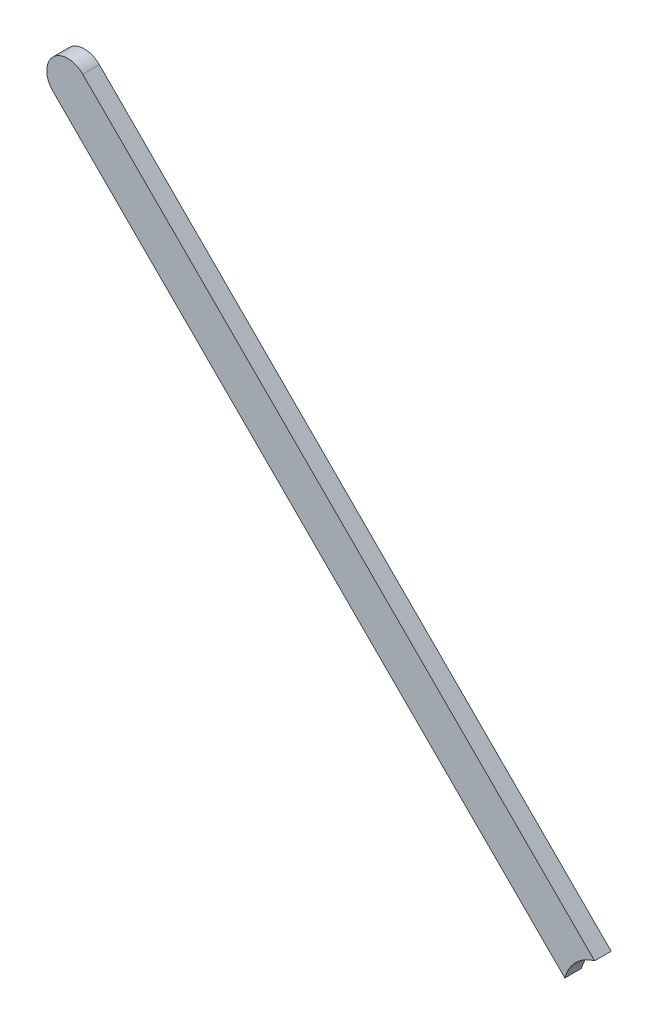
ISO-10303-21;
HEADER;
FILE_DESCRIPTION(('STEP AP214'),'2;1');
FILE_NAME('part.step','',(''),(''),'','','');
FILE_SCHEMA(('AUTOMOTIVE_DESIGN { 1 0 10303 214 1 1 1 1 }'));
ENDSEC;
DATA;
#1=APPLICATION_CONTEXT('core data for automotive mechanical design processes');
#2=APPLICATION_PROTOCOL_DEFINITION('international standard','automotive_design',2000,#1);
#3=PRODUCT_CONTEXT('',#1,'mechanical');
#4=PRODUCT('Part','Part','',(#3));
#5=PRODUCT_RELATED_PRODUCT_CATEGORY('part','',(#4));
#6=PRODUCT_DEFINITION_FORMATION('','',#4);
#7=PRODUCT_DEFINITION_CONTEXT('part definition',#1,'design');
#8=PRODUCT_DEFINITION('design','',#6,#7);
#9=PRODUCT_DEFINITION_SHAPE('','',#8);
#10=(LENGTH_UNIT() NAMED_UNIT(*) SI_UNIT(.MILLI.,.METRE.));
#11=(NAMED_UNIT(*) PLANE_ANGLE_UNIT() SI_UNIT($,.RADIAN.));
#12=(NAMED_UNIT(*) SI_UNIT($,.STERADIAN.) SOLID_ANGLE_UNIT());
#13=UNCERTAINTY_MEASURE_WITH_UNIT(LENGTH_MEASURE(1.E-05),#10,'distance_accuracy_value','');
#14=(GEOMETRIC_REPRESENTATION_CONTEXT(3) GLOBAL_UNCERTAINTY_ASSIGNED_CONTEXT((#13)) GLOBAL_UNIT_ASSIGNED_CONTEXT((#10,
#11,#12)) REPRESENTATION_CONTEXT('',''));
#15=CARTESIAN_POINT('',(0.,0.,0.));
#16=DIRECTION('',(0.,0.,1.));
#17=DIRECTION('',(1.,0.,0.));
#18=AXIS2_PLACEMENT_3D('',#15,#16,#17);
#19=CARTESIAN_POINT('',(141.6661378,61.46517806,0.));
#20=DIRECTION('',(0.707106781186548,0.707106781186548,0.));
#21=DIRECTION('',(0.707106781186548,-0.707106781186548,0.));
#22=AXIS2_PLACEMENT_3D('',#19,#20,#21);
#23=PLANE('',#22);
#24=DIRECTION('',(0.707106781186548,-0.707106781186548,0.));
#25=VECTOR('',#24,1.);
#26=CARTESIAN_POINT('',(141.6661378,61.46517806,0.1999996));
#27=LINE('',#26,#25);
#28=CARTESIAN_POINT('',(141.6661378,61.46517806,0.1999996));
#29=VERTEX_POINT('',#28);
#30=CARTESIAN_POINT('',(147.845309871461,55.2860059885386,0.1999996));
#31=VERTEX_POINT('',#30);
#32=EDGE_CURVE('E11',#29,#31,#27,.T.);
#33=ORIENTED_EDGE('',*,*,#32,.F.);
#34=DIRECTION('',(0.,0.,1.));
#35=VECTOR('',#34,1.);
#36=CARTESIAN_POINT('',(141.6661378,61.46517806,0.));
#37=LINE('',#36,#35);
#38=CARTESIAN_POINT('',(141.6661378,61.46517806,0.));
#39=VERTEX_POINT('',#38);
#40=EDGE_CURVE('E24',#39,#29,#37,.T.);
#41=ORIENTED_EDGE('',*,*,#40,.F.);
#42=DIRECTION('',(0.707106781186548,-0.707106781186548,0.));
#43=VECTOR('',#42,1.);
#44=CARTESIAN_POINT('',(141.6661378,61.46517806,0.));
#45=LINE('',#44,#43);
#46=CARTESIAN_POINT('',(147.845309871461,55.2860059885386,0.));
#47=VERTEX_POINT('',#46);
#48=EDGE_CURVE('E75',#39,#47,#45,.T.);
#49=ORIENTED_EDGE('',*,*,#48,.T.);
#50=DIRECTION('',(0.,0.,1.));
#51=VECTOR('',#50,1.);
#52=CARTESIAN_POINT('',(147.845309871461,55.2860059885386,0.));
#53=LINE('',#52,#51);
#54=EDGE_CURVE('E37',#47,#31,#53,.T.);
#55=ORIENTED_EDGE('',*,*,#54,.T.);
#56=EDGE_LOOP('',(#33,#41,#49,#55));
#57=FACE_BOUND('',#56,.T.);
#58=ADVANCED_FACE('F17',(#57),#23,.F.);
#59=CARTESIAN_POINT('',(148.336,55.1545252,0.));
#60=DIRECTION('',(0.,0.,-1.));
#61=DIRECTION('',(1.,0.,0.));
#62=AXIS2_PLACEMENT_3D('',#59,#60,#61);
#63=CYLINDRICAL_SURFACE('',#62,0.508);
#64=DIRECTION('',(0.,0.,1.));
#65=VECTOR('',#64,1.);
#66=CARTESIAN_POINT('',(148.204519211461,55.6452153285386,0.));
#67=LINE('',#66,#65);
#68=CARTESIAN_POINT('',(148.204519211461,55.6452153285386,0.));
#69=VERTEX_POINT('',#68);
#70=CARTESIAN_POINT('',(148.204519211461,55.6452153285386,0.1999996));
#71=VERTEX_POINT('',#70);
#72=EDGE_CURVE('E67',#69,#71,#67,.T.);
#73=ORIENTED_EDGE('',*,*,#72,.T.);
#74=CARTESIAN_POINT('',(148.336,55.1545252,0.1999996));
#75=DIRECTION('',(0.,0.,1.));
#76=DIRECTION('',(1.,0.,0.));
#77=AXIS2_PLACEMENT_3D('',#74,#75,#76);
#78=CIRCLE('',#77,0.508);
#79=EDGE_CURVE('E82',#71,#31,#78,.T.);
#80=ORIENTED_EDGE('',*,*,#79,.T.);
#81=ORIENTED_EDGE('',*,*,#54,.F.);
#82=CARTESIAN_POINT('',(148.336,55.1545252,0.));
#83=DIRECTION('',(0.,0.,1.));
#84=DIRECTION('',(1.,0.,0.));
#85=AXIS2_PLACEMENT_3D('',#82,#83,#84);
#86=CIRCLE('',#85,0.508);
#87=EDGE_CURVE('E80',#69,#47,#86,.T.);
#88=ORIENTED_EDGE('',*,*,#87,.F.);
#89=EDGE_LOOP('',(#73,#80,#81,#88));
#90=FACE_BOUND('',#89,.T.);
#91=ADVANCED_FACE('F88',(#90),#63,.F.);
#92=CARTESIAN_POINT('',(148.204519211461,55.6452153285386,0.));
#93=DIRECTION('',(-0.707106781186546,-0.70710678118655,0.));
#94=DIRECTION('',(-0.70710678118655,0.707106781186546,0.));
#95=AXIS2_PLACEMENT_3D('',#92,#93,#94);
#96=PLANE('',#95);
#97=DIRECTION('',(-0.70710678118655,0.707106781186546,0.));
#98=VECTOR('',#97,1.);
#99=CARTESIAN_POINT('',(148.5156034,55.33413114,0.1999996));
#100=LINE('',#99,#98);
#101=CARTESIAN_POINT('',(142.02534714,61.8243874,0.1999996));
#102=VERTEX_POINT('',#101);
#103=EDGE_CURVE('E71',#71,#102,#100,.T.);
#104=ORIENTED_EDGE('',*,*,#103,.F.);
#105=ORIENTED_EDGE('',*,*,#72,.F.);
#106=DIRECTION('',(-0.70710678118655,0.707106781186546,0.));
#107=VECTOR('',#106,1.);
#108=CARTESIAN_POINT('',(148.5156034,55.33413114,0.));
#109=LINE('',#108,#107);
#110=CARTESIAN_POINT('',(142.02534714,61.8243874,0.));
#111=VERTEX_POINT('',#110);
#112=EDGE_CURVE('E63',#69,#111,#109,.T.);
#113=ORIENTED_EDGE('',*,*,#112,.T.);
#114=DIRECTION('',(0.,0.,1.));
#115=VECTOR('',#114,1.);
#116=CARTESIAN_POINT('',(142.02534714,61.8243874,0.));
#117=LINE('',#116,#115);
#118=EDGE_CURVE('E53',#111,#102,#117,.T.);
#119=ORIENTED_EDGE('',*,*,#118,.T.);
#120=EDGE_LOOP('',(#104,#105,#113,#119));
#121=FACE_BOUND('',#120,.T.);
#122=ADVANCED_FACE('F66',(#121),#96,.F.);
#123=CARTESIAN_POINT('',(141.84574247,61.64478273,0.));
#124=DIRECTION('',(0.,0.,-1.));
#125=DIRECTION('',(0.707106781186492,0.707106781186603,0.));
#126=AXIS2_PLACEMENT_3D('',#123,#124,#125);
#127=CYLINDRICAL_SURFACE('',#126,0.253999360179541);
#128=CARTESIAN_POINT('',(141.84574247,61.64478273,0.1999996));
#129=DIRECTION('',(0.,0.,1.));
#130=DIRECTION('',(0.707106781186492,0.707106781186603,0.));
#131=AXIS2_PLACEMENT_3D('',#128,#129,#130);
#132=CIRCLE('',#131,0.253999360179541);
#133=EDGE_CURVE('E59',#102,#29,#132,.T.);
#134=ORIENTED_EDGE('',*,*,#133,.F.);
#135=ORIENTED_EDGE('',*,*,#118,.F.);
#136=CARTESIAN_POINT('',(141.84574247,61.64478273,0.));
#137=DIRECTION('',(0.,0.,1.));
#138=DIRECTION('',(0.707106781186492,0.707106781186603,0.));
#139=AXIS2_PLACEMENT_3D('',#136,#137,#138);
#140=CIRCLE('',#139,0.253999360179541);
#141=EDGE_CURVE('E57',#111,#39,#140,.T.);
#142=ORIENTED_EDGE('',*,*,#141,.T.);
#143=ORIENTED_EDGE('',*,*,#40,.T.);
#144=EDGE_LOOP('',(#134,#135,#142,#143));
#145=FACE_BOUND('',#144,.T.);
#146=ADVANCED_FACE('F55',(#145),#127,.T.);
#147=CARTESIAN_POINT('',(141.6661378,61.46517806,0.));
#148=DIRECTION('',(0.,0.,-1.));
#149=DIRECTION('',(-1.,0.,0.));
#150=AXIS2_PLACEMENT_3D('',#147,#148,#149);
#151=PLANE('',#150);
#152=ORIENTED_EDGE('',*,*,#48,.F.);
#153=ORIENTED_EDGE('',*,*,#141,.F.);
#154=ORIENTED_EDGE('',*,*,#112,.F.);
#155=ORIENTED_EDGE('',*,*,#87,.T.);
#156=EDGE_LOOP('',(#152,#153,#154,#155));
#157=FACE_BOUND('',#156,.T.);
#158=ADVANCED_FACE('F74',(#157),#151,.T.);
#159=CARTESIAN_POINT('',(141.6661378,61.46517806,0.1999996));
#160=DIRECTION('',(0.,0.,-1.));
#161=DIRECTION('',(-1.,0.,0.));
#162=AXIS2_PLACEMENT_3D('',#159,#160,#161);
#163=PLANE('',#162);
#164=ORIENTED_EDGE('',*,*,#133,.T.);
#165=ORIENTED_EDGE('',*,*,#32,.T.);
#166=ORIENTED_EDGE('',*,*,#79,.F.);
#167=ORIENTED_EDGE('',*,*,#103,.T.);
#168=EDGE_LOOP('',(#164,#165,#166,#167));
#169=FACE_BOUND('',#168,.T.);
#170=ADVANCED_FACE('F91',(#169),#163,.F.);
#171=CLOSED_SHELL('',(#58,#91,#122,#146,#158,#170));
#172=MANIFOLD_SOLID_BREP('B1',#171);
#173=ADVANCED_BREP_SHAPE_REPRESENTATION('',(#18,#172),#14);
#174=SHAPE_DEFINITION_REPRESENTATION(#9,#173);
ENDSEC;
END-ISO-10303-21;
